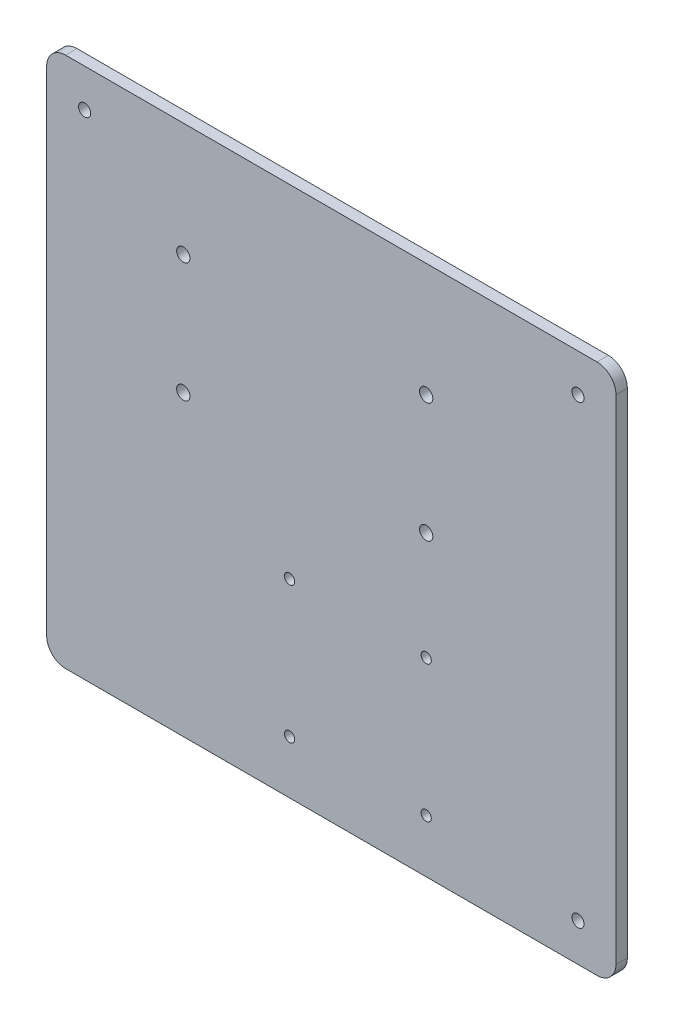
ISO-10303-21;
HEADER;
FILE_DESCRIPTION(('STEP AP214'),'2;1');
FILE_NAME('part.step','',(''),(''),'','','');
FILE_SCHEMA(('AUTOMOTIVE_DESIGN { 1 0 10303 214 1 1 1 1 }'));
ENDSEC;
DATA;
#1=APPLICATION_CONTEXT('core data for automotive mechanical design processes');
#2=APPLICATION_PROTOCOL_DEFINITION('international standard','automotive_design',2000,#1);
#3=PRODUCT_CONTEXT('',#1,'mechanical');
#4=PRODUCT('Part','Part','',(#3));
#5=PRODUCT_RELATED_PRODUCT_CATEGORY('part','',(#4));
#6=PRODUCT_DEFINITION_FORMATION('','',#4);
#7=PRODUCT_DEFINITION_CONTEXT('part definition',#1,'design');
#8=PRODUCT_DEFINITION('design','',#6,#7);
#9=PRODUCT_DEFINITION_SHAPE('','',#8);
#10=(LENGTH_UNIT() NAMED_UNIT(*) SI_UNIT(.MILLI.,.METRE.));
#11=(NAMED_UNIT(*) PLANE_ANGLE_UNIT() SI_UNIT($,.RADIAN.));
#12=(NAMED_UNIT(*) SI_UNIT($,.STERADIAN.) SOLID_ANGLE_UNIT());
#13=UNCERTAINTY_MEASURE_WITH_UNIT(LENGTH_MEASURE(1.E-05),#10,'distance_accuracy_value','');
#14=(GEOMETRIC_REPRESENTATION_CONTEXT(3) GLOBAL_UNCERTAINTY_ASSIGNED_CONTEXT((#13)) GLOBAL_UNIT_ASSIGNED_CONTEXT((#10,
#11,#12)) REPRESENTATION_CONTEXT('',''));
#15=CARTESIAN_POINT('',(0.,0.,0.));
#16=DIRECTION('',(0.,0.,1.));
#17=DIRECTION('',(1.,0.,0.));
#18=AXIS2_PLACEMENT_3D('',#15,#16,#17);
#19=CARTESIAN_POINT('',(75.,70.,3.));
#20=DIRECTION('',(-1.,0.,0.));
#21=DIRECTION('',(0.,-1.,0.));
#22=AXIS2_PLACEMENT_3D('',#19,#20,#21);
#23=PLANE('',#22);
#24=DIRECTION('',(0.,1.,0.));
#25=VECTOR('',#24,1.);
#26=CARTESIAN_POINT('',(75.,70.,3.));
#27=LINE('',#26,#25);
#28=CARTESIAN_POINT('',(75.,-65.,3.));
#29=VERTEX_POINT('',#28);
#30=CARTESIAN_POINT('',(75.,65.,3.));
#31=VERTEX_POINT('',#30);
#32=EDGE_CURVE('E133',#29,#31,#27,.T.);
#33=ORIENTED_EDGE('',*,*,#32,.F.);
#34=DIRECTION('',(0.,0.,-1.));
#35=VECTOR('',#34,1.);
#36=CARTESIAN_POINT('',(75.,-65.,3.));
#37=LINE('',#36,#35);
#38=CARTESIAN_POINT('',(75.,-65.,0.));
#39=VERTEX_POINT('',#38);
#40=EDGE_CURVE('E198',#29,#39,#37,.T.);
#41=ORIENTED_EDGE('',*,*,#40,.T.);
#42=DIRECTION('',(0.,1.,0.));
#43=VECTOR('',#42,1.);
#44=CARTESIAN_POINT('',(75.,70.,0.));
#45=LINE('',#44,#43);
#46=CARTESIAN_POINT('',(75.,65.,0.));
#47=VERTEX_POINT('',#46);
#48=EDGE_CURVE('E155',#39,#47,#45,.T.);
#49=ORIENTED_EDGE('',*,*,#48,.T.);
#50=DIRECTION('',(0.,0.,-1.));
#51=VECTOR('',#50,1.);
#52=CARTESIAN_POINT('',(75.,65.,3.));
#53=LINE('',#52,#51);
#54=EDGE_CURVE('E196',#47,#31,#53,.F.);
#55=ORIENTED_EDGE('',*,*,#54,.T.);
#56=EDGE_LOOP('',(#33,#41,#49,#55));
#57=FACE_BOUND('',#56,.T.);
#58=ADVANCED_FACE('F41',(#57),#23,.F.);
#59=CARTESIAN_POINT('',(-75.,70.,3.));
#60=DIRECTION('',(0.,-1.,0.));
#61=DIRECTION('',(0.,0.,-1.));
#62=AXIS2_PLACEMENT_3D('',#59,#60,#61);
#63=PLANE('',#62);
#64=DIRECTION('',(-1.,0.,0.));
#65=VECTOR('',#64,1.);
#66=CARTESIAN_POINT('',(-75.,70.,3.));
#67=LINE('',#66,#65);
#68=CARTESIAN_POINT('',(70.,70.,3.));
#69=VERTEX_POINT('',#68);
#70=CARTESIAN_POINT('',(-70.,70.,3.));
#71=VERTEX_POINT('',#70);
#72=EDGE_CURVE('E136',#69,#71,#67,.T.);
#73=ORIENTED_EDGE('',*,*,#72,.F.);
#74=DIRECTION('',(0.,0.,-1.));
#75=VECTOR('',#74,1.);
#76=CARTESIAN_POINT('',(70.,70.,3.));
#77=LINE('',#76,#75);
#78=CARTESIAN_POINT('',(70.,70.,0.));
#79=VERTEX_POINT('',#78);
#80=EDGE_CURVE('E11',#69,#79,#77,.T.);
#81=ORIENTED_EDGE('',*,*,#80,.T.);
#82=DIRECTION('',(-1.,0.,0.));
#83=VECTOR('',#82,1.);
#84=CARTESIAN_POINT('',(-75.,70.,0.));
#85=LINE('',#84,#83);
#86=CARTESIAN_POINT('',(-70.,70.,0.));
#87=VERTEX_POINT('',#86);
#88=EDGE_CURVE('E138',#79,#87,#85,.T.);
#89=ORIENTED_EDGE('',*,*,#88,.T.);
#90=DIRECTION('',(0.,0.,-1.));
#91=VECTOR('',#90,1.);
#92=CARTESIAN_POINT('',(-70.,70.,3.));
#93=LINE('',#92,#91);
#94=EDGE_CURVE('E49',#87,#71,#93,.F.);
#95=ORIENTED_EDGE('',*,*,#94,.T.);
#96=EDGE_LOOP('',(#73,#81,#89,#95));
#97=FACE_BOUND('',#96,.T.);
#98=ADVANCED_FACE('F275',(#97),#63,.F.);
#99=CARTESIAN_POINT('',(-75.,70.,3.));
#100=DIRECTION('',(1.,0.,0.));
#101=DIRECTION('',(0.,1.,0.));
#102=AXIS2_PLACEMENT_3D('',#99,#100,#101);
#103=PLANE('',#102);
#104=DIRECTION('',(0.,-1.,0.));
#105=VECTOR('',#104,1.);
#106=CARTESIAN_POINT('',(-75.,70.,0.));
#107=LINE('',#106,#105);
#108=CARTESIAN_POINT('',(-75.,65.,0.));
#109=VERTEX_POINT('',#108);
#110=CARTESIAN_POINT('',(-75.,-65.,0.));
#111=VERTEX_POINT('',#110);
#112=EDGE_CURVE('E134',#109,#111,#107,.T.);
#113=ORIENTED_EDGE('',*,*,#112,.T.);
#114=DIRECTION('',(0.,0.,-1.));
#115=VECTOR('',#114,1.);
#116=CARTESIAN_POINT('',(-75.,-65.,3.));
#117=LINE('',#116,#115);
#118=CARTESIAN_POINT('',(-75.,-65.,3.));
#119=VERTEX_POINT('',#118);
#120=EDGE_CURVE('E112',#111,#119,#117,.F.);
#121=ORIENTED_EDGE('',*,*,#120,.T.);
#122=DIRECTION('',(0.,-1.,0.));
#123=VECTOR('',#122,1.);
#124=CARTESIAN_POINT('',(-75.,70.,3.));
#125=LINE('',#124,#123);
#126=CARTESIAN_POINT('',(-75.,65.,3.));
#127=VERTEX_POINT('',#126);
#128=EDGE_CURVE('E211',#127,#119,#125,.T.);
#129=ORIENTED_EDGE('',*,*,#128,.F.);
#130=DIRECTION('',(0.,0.,-1.));
#131=VECTOR('',#130,1.);
#132=CARTESIAN_POINT('',(-75.,65.,3.));
#133=LINE('',#132,#131);
#134=EDGE_CURVE('E117',#127,#109,#133,.T.);
#135=ORIENTED_EDGE('',*,*,#134,.T.);
#136=EDGE_LOOP('',(#113,#121,#129,#135));
#137=FACE_BOUND('',#136,.T.);
#138=ADVANCED_FACE('F273',(#137),#103,.F.);
#139=CARTESIAN_POINT('',(-75.,-70.,3.));
#140=DIRECTION('',(0.,1.,0.));
#141=DIRECTION('',(0.,0.,1.));
#142=AXIS2_PLACEMENT_3D('',#139,#140,#141);
#143=PLANE('',#142);
#144=DIRECTION('',(1.,0.,0.));
#145=VECTOR('',#144,1.);
#146=CARTESIAN_POINT('',(-75.,-70.,3.));
#147=LINE('',#146,#145);
#148=CARTESIAN_POINT('',(-70.,-70.,3.));
#149=VERTEX_POINT('',#148);
#150=CARTESIAN_POINT('',(70.,-70.,3.));
#151=VERTEX_POINT('',#150);
#152=EDGE_CURVE('E127',#149,#151,#147,.T.);
#153=ORIENTED_EDGE('',*,*,#152,.F.);
#154=DIRECTION('',(0.,0.,-1.));
#155=VECTOR('',#154,1.);
#156=CARTESIAN_POINT('',(-70.,-70.,3.));
#157=LINE('',#156,#155);
#158=CARTESIAN_POINT('',(-70.,-70.,0.));
#159=VERTEX_POINT('',#158);
#160=EDGE_CURVE('E111',#149,#159,#157,.T.);
#161=ORIENTED_EDGE('',*,*,#160,.T.);
#162=DIRECTION('',(1.,0.,0.));
#163=VECTOR('',#162,1.);
#164=CARTESIAN_POINT('',(-75.,-70.,0.));
#165=LINE('',#164,#163);
#166=CARTESIAN_POINT('',(70.,-70.,0.));
#167=VERTEX_POINT('',#166);
#168=EDGE_CURVE('E124',#159,#167,#165,.T.);
#169=ORIENTED_EDGE('',*,*,#168,.T.);
#170=DIRECTION('',(0.,0.,-1.));
#171=VECTOR('',#170,1.);
#172=CARTESIAN_POINT('',(70.,-70.,3.));
#173=LINE('',#172,#171);
#174=EDGE_CURVE('E129',#167,#151,#173,.F.);
#175=ORIENTED_EDGE('',*,*,#174,.T.);
#176=EDGE_LOOP('',(#153,#161,#169,#175));
#177=FACE_BOUND('',#176,.T.);
#178=ADVANCED_FACE('F123',(#177),#143,.F.);
#179=CARTESIAN_POINT('',(0.,0.,3.));
#180=DIRECTION('',(0.,0.,1.));
#181=DIRECTION('',(1.,0.,0.));
#182=AXIS2_PLACEMENT_3D('',#179,#180,#181);
#183=PLANE('',#182);
#184=CARTESIAN_POINT('',(65.0000000000013,-60.,3.));
#185=DIRECTION('',(0.,0.,1.));
#186=DIRECTION('',(1.,0.,0.));
#187=AXIS2_PLACEMENT_3D('',#184,#185,#186);
#188=CIRCLE('',#187,1.60000000000001);
#189=CARTESIAN_POINT('',(66.6000000000013,-60.,3.));
#190=VERTEX_POINT('',#189);
#191=EDGE_CURVE('E238',#190,#190,#188,.T.);
#192=ORIENTED_EDGE('',*,*,#191,.F.);
#193=EDGE_LOOP('',(#192));
#194=FACE_BOUND('',#193,.T.);
#195=CARTESIAN_POINT('',(-65.,59.9999999999991,3.));
#196=DIRECTION('',(0.,0.,1.));
#197=DIRECTION('',(1.,0.,0.));
#198=AXIS2_PLACEMENT_3D('',#195,#196,#197);
#199=CIRCLE('',#198,1.60000000000001);
#200=CARTESIAN_POINT('',(-63.4,59.9999999999991,3.));
#201=VERTEX_POINT('',#200);
#202=EDGE_CURVE('E237',#201,#201,#199,.T.);
#203=ORIENTED_EDGE('',*,*,#202,.F.);
#204=EDGE_LOOP('',(#203));
#205=FACE_BOUND('',#204,.T.);
#206=CARTESIAN_POINT('',(65.,60.,3.));
#207=DIRECTION('',(0.,0.,1.));
#208=DIRECTION('',(1.,0.,0.));
#209=AXIS2_PLACEMENT_3D('',#206,#207,#208);
#210=CIRCLE('',#209,1.60000000000001);
#211=CARTESIAN_POINT('',(66.6,60.,3.));
#212=VERTEX_POINT('',#211);
#213=EDGE_CURVE('E174',#212,#212,#210,.T.);
#214=ORIENTED_EDGE('',*,*,#213,.F.);
#215=EDGE_LOOP('',(#214));
#216=FACE_BOUND('',#215,.T.);
#217=CARTESIAN_POINT('',(25.0000000000004,-56.,3.));
#218=DIRECTION('',(0.,0.,1.));
#219=DIRECTION('',(1.,0.,0.));
#220=AXIS2_PLACEMENT_3D('',#217,#218,#219);
#221=CIRCLE('',#220,1.35);
#222=CARTESIAN_POINT('',(26.3500000000004,-56.,3.));
#223=VERTEX_POINT('',#222);
#224=EDGE_CURVE('E180',#223,#223,#221,.T.);
#225=ORIENTED_EDGE('',*,*,#224,.F.);
#226=EDGE_LOOP('',(#225));
#227=FACE_BOUND('',#226,.T.);
#228=CARTESIAN_POINT('',(-10.9999999999996,-56.0000000000002,3.));
#229=DIRECTION('',(0.,0.,1.));
#230=DIRECTION('',(1.,0.,0.));
#231=AXIS2_PLACEMENT_3D('',#228,#229,#230);
#232=CIRCLE('',#231,1.35);
#233=CARTESIAN_POINT('',(-9.64999999999963,-56.0000000000002,3.));
#234=VERTEX_POINT('',#233);
#235=EDGE_CURVE('E230',#234,#234,#232,.T.);
#236=ORIENTED_EDGE('',*,*,#235,.F.);
#237=EDGE_LOOP('',(#236));
#238=FACE_BOUND('',#237,.T.);
#239=CARTESIAN_POINT('',(-11.,-20.0000000000003,3.));
#240=DIRECTION('',(0.,0.,1.));
#241=DIRECTION('',(1.,0.,0.));
#242=AXIS2_PLACEMENT_3D('',#239,#240,#241);
#243=CIRCLE('',#242,1.35);
#244=CARTESIAN_POINT('',(-9.65,-20.0000000000003,3.));
#245=VERTEX_POINT('',#244);
#246=EDGE_CURVE('E227',#245,#245,#243,.T.);
#247=ORIENTED_EDGE('',*,*,#246,.F.);
#248=EDGE_LOOP('',(#247));
#249=FACE_BOUND('',#248,.T.);
#250=CARTESIAN_POINT('',(25.,-20.,3.));
#251=DIRECTION('',(0.,0.,1.));
#252=DIRECTION('',(1.,0.,0.));
#253=AXIS2_PLACEMENT_3D('',#250,#251,#252);
#254=CIRCLE('',#253,1.35);
#255=CARTESIAN_POINT('',(26.35,-20.,3.));
#256=VERTEX_POINT('',#255);
#257=EDGE_CURVE('E160',#256,#256,#254,.T.);
#258=ORIENTED_EDGE('',*,*,#257,.F.);
#259=EDGE_LOOP('',(#258));
#260=FACE_BOUND('',#259,.T.);
#261=CARTESIAN_POINT('',(-39.,39.9999999999987,3.));
#262=DIRECTION('',(0.,0.,1.));
#263=DIRECTION('',(1.,0.,0.));
#264=AXIS2_PLACEMENT_3D('',#261,#262,#263);
#265=CIRCLE('',#264,1.75);
#266=CARTESIAN_POINT('',(-37.25,39.9999999999987,3.));
#267=VERTEX_POINT('',#266);
#268=EDGE_CURVE('E217',#267,#267,#265,.T.);
#269=ORIENTED_EDGE('',*,*,#268,.F.);
#270=EDGE_LOOP('',(#269));
#271=FACE_BOUND('',#270,.T.);
#272=CARTESIAN_POINT('',(25.0000000000008,8.50000000000001,3.));
#273=DIRECTION('',(0.,0.,1.));
#274=DIRECTION('',(1.,0.,0.));
#275=AXIS2_PLACEMENT_3D('',#272,#273,#274);
#276=CIRCLE('',#275,1.75);
#277=CARTESIAN_POINT('',(26.7500000000008,8.50000000000001,3.));
#278=VERTEX_POINT('',#277);
#279=EDGE_CURVE('E218',#278,#278,#276,.T.);
#280=ORIENTED_EDGE('',*,*,#279,.F.);
#281=EDGE_LOOP('',(#280));
#282=FACE_BOUND('',#281,.T.);
#283=CARTESIAN_POINT('',(-38.9999999999992,8.49999999999868,3.));
#284=DIRECTION('',(0.,0.,1.));
#285=DIRECTION('',(1.,0.,0.));
#286=AXIS2_PLACEMENT_3D('',#283,#284,#285);
#287=CIRCLE('',#286,1.75);
#288=CARTESIAN_POINT('',(-37.2499999999992,8.49999999999868,3.));
#289=VERTEX_POINT('',#288);
#290=EDGE_CURVE('E169',#289,#289,#287,.T.);
#291=ORIENTED_EDGE('',*,*,#290,.F.);
#292=EDGE_LOOP('',(#291));
#293=FACE_BOUND('',#292,.T.);
#294=CARTESIAN_POINT('',(25.,40.,3.));
#295=DIRECTION('',(0.,0.,1.));
#296=DIRECTION('',(1.,0.,0.));
#297=AXIS2_PLACEMENT_3D('',#294,#295,#296);
#298=CIRCLE('',#297,1.75);
#299=CARTESIAN_POINT('',(26.75,40.,3.));
#300=VERTEX_POINT('',#299);
#301=EDGE_CURVE('E146',#300,#300,#298,.T.);
#302=ORIENTED_EDGE('',*,*,#301,.F.);
#303=EDGE_LOOP('',(#302));
#304=FACE_BOUND('',#303,.T.);
#305=ORIENTED_EDGE('',*,*,#128,.T.);
#306=CARTESIAN_POINT('',(-70.,-65.,3.));
#307=DIRECTION('',(0.,0.,1.));
#308=DIRECTION('',(1.,0.,0.));
#309=AXIS2_PLACEMENT_3D('',#306,#307,#308);
#310=CIRCLE('',#309,5.);
#311=EDGE_CURVE('E194',#119,#149,#310,.T.);
#312=ORIENTED_EDGE('',*,*,#311,.T.);
#313=ORIENTED_EDGE('',*,*,#152,.T.);
#314=CARTESIAN_POINT('',(70.,-65.,3.));
#315=DIRECTION('',(0.,0.,1.));
#316=DIRECTION('',(1.,0.,0.));
#317=AXIS2_PLACEMENT_3D('',#314,#315,#316);
#318=CIRCLE('',#317,5.);
#319=EDGE_CURVE('E192',#151,#29,#318,.T.);
#320=ORIENTED_EDGE('',*,*,#319,.T.);
#321=ORIENTED_EDGE('',*,*,#32,.T.);
#322=CARTESIAN_POINT('',(70.,65.,3.));
#323=DIRECTION('',(0.,0.,1.));
#324=DIRECTION('',(1.,0.,0.));
#325=AXIS2_PLACEMENT_3D('',#322,#323,#324);
#326=CIRCLE('',#325,5.);
#327=EDGE_CURVE('E62',#31,#69,#326,.T.);
#328=ORIENTED_EDGE('',*,*,#327,.T.);
#329=ORIENTED_EDGE('',*,*,#72,.T.);
#330=CARTESIAN_POINT('',(-70.,65.,3.));
#331=DIRECTION('',(0.,0.,1.));
#332=DIRECTION('',(1.,0.,0.));
#333=AXIS2_PLACEMENT_3D('',#330,#331,#332);
#334=CIRCLE('',#333,5.);
#335=EDGE_CURVE('E189',#71,#127,#334,.T.);
#336=ORIENTED_EDGE('',*,*,#335,.T.);
#337=EDGE_LOOP('',(#305,#312,#313,#320,#321,#328,#329,#336));
#338=FACE_BOUND('',#337,.T.);
#339=ADVANCED_FACE('F247',(#194,#205,#216,#227,#238,#249,#260,#271,#282,#293,#304,#338),#183,.T.);
#340=CARTESIAN_POINT('',(0.,0.,0.));
#341=DIRECTION('',(0.,0.,1.));
#342=DIRECTION('',(1.,0.,0.));
#343=AXIS2_PLACEMENT_3D('',#340,#341,#342);
#344=PLANE('',#343);
#345=CARTESIAN_POINT('',(65.0000000000013,-60.,0.));
#346=DIRECTION('',(0.,0.,1.));
#347=DIRECTION('',(1.,0.,0.));
#348=AXIS2_PLACEMENT_3D('',#345,#346,#347);
#349=CIRCLE('',#348,1.60000000000001);
#350=CARTESIAN_POINT('',(66.6000000000013,-60.,0.));
#351=VERTEX_POINT('',#350);
#352=EDGE_CURVE('E177',#351,#351,#349,.T.);
#353=ORIENTED_EDGE('',*,*,#352,.T.);
#354=EDGE_LOOP('',(#353));
#355=FACE_BOUND('',#354,.T.);
#356=CARTESIAN_POINT('',(-65.,59.9999999999991,0.));
#357=DIRECTION('',(0.,0.,1.));
#358=DIRECTION('',(1.,0.,0.));
#359=AXIS2_PLACEMENT_3D('',#356,#357,#358);
#360=CIRCLE('',#359,1.60000000000001);
#361=CARTESIAN_POINT('',(-63.4,59.9999999999991,0.));
#362=VERTEX_POINT('',#361);
#363=EDGE_CURVE('E173',#362,#362,#360,.T.);
#364=ORIENTED_EDGE('',*,*,#363,.T.);
#365=EDGE_LOOP('',(#364));
#366=FACE_BOUND('',#365,.T.);
#367=CARTESIAN_POINT('',(65.,60.,0.));
#368=DIRECTION('',(0.,0.,1.));
#369=DIRECTION('',(1.,0.,0.));
#370=AXIS2_PLACEMENT_3D('',#367,#368,#369);
#371=CIRCLE('',#370,1.60000000000001);
#372=CARTESIAN_POINT('',(66.6,60.,0.));
#373=VERTEX_POINT('',#372);
#374=EDGE_CURVE('E170',#373,#373,#371,.T.);
#375=ORIENTED_EDGE('',*,*,#374,.T.);
#376=EDGE_LOOP('',(#375));
#377=FACE_BOUND('',#376,.T.);
#378=CARTESIAN_POINT('',(25.0000000000004,-56.,0.));
#379=DIRECTION('',(0.,0.,1.));
#380=DIRECTION('',(1.,0.,0.));
#381=AXIS2_PLACEMENT_3D('',#378,#379,#380);
#382=CIRCLE('',#381,1.35);
#383=CARTESIAN_POINT('',(26.3500000000004,-56.,0.));
#384=VERTEX_POINT('',#383);
#385=EDGE_CURVE('E166',#384,#384,#382,.T.);
#386=ORIENTED_EDGE('',*,*,#385,.T.);
#387=EDGE_LOOP('',(#386));
#388=FACE_BOUND('',#387,.T.);
#389=CARTESIAN_POINT('',(-10.9999999999996,-56.0000000000002,0.));
#390=DIRECTION('',(0.,0.,1.));
#391=DIRECTION('',(1.,0.,0.));
#392=AXIS2_PLACEMENT_3D('',#389,#390,#391);
#393=CIRCLE('',#392,1.35);
#394=CARTESIAN_POINT('',(-9.64999999999963,-56.0000000000002,0.));
#395=VERTEX_POINT('',#394);
#396=EDGE_CURVE('E163',#395,#395,#393,.T.);
#397=ORIENTED_EDGE('',*,*,#396,.T.);
#398=EDGE_LOOP('',(#397));
#399=FACE_BOUND('',#398,.T.);
#400=CARTESIAN_POINT('',(-11.,-20.0000000000003,0.));
#401=DIRECTION('',(0.,0.,1.));
#402=DIRECTION('',(1.,0.,0.));
#403=AXIS2_PLACEMENT_3D('',#400,#401,#402);
#404=CIRCLE('',#403,1.35);
#405=CARTESIAN_POINT('',(-9.65,-20.0000000000003,0.));
#406=VERTEX_POINT('',#405);
#407=EDGE_CURVE('E159',#406,#406,#404,.T.);
#408=ORIENTED_EDGE('',*,*,#407,.T.);
#409=EDGE_LOOP('',(#408));
#410=FACE_BOUND('',#409,.T.);
#411=CARTESIAN_POINT('',(25.,-20.,0.));
#412=DIRECTION('',(0.,0.,1.));
#413=DIRECTION('',(1.,0.,0.));
#414=AXIS2_PLACEMENT_3D('',#411,#412,#413);
#415=CIRCLE('',#414,1.35);
#416=CARTESIAN_POINT('',(26.35,-20.,0.));
#417=VERTEX_POINT('',#416);
#418=EDGE_CURVE('E156',#417,#417,#415,.T.);
#419=ORIENTED_EDGE('',*,*,#418,.T.);
#420=EDGE_LOOP('',(#419));
#421=FACE_BOUND('',#420,.T.);
#422=CARTESIAN_POINT('',(-39.,39.9999999999987,0.));
#423=DIRECTION('',(0.,0.,1.));
#424=DIRECTION('',(1.,0.,0.));
#425=AXIS2_PLACEMENT_3D('',#422,#423,#424);
#426=CIRCLE('',#425,1.75);
#427=CARTESIAN_POINT('',(-37.25,39.9999999999987,0.));
#428=VERTEX_POINT('',#427);
#429=EDGE_CURVE('E152',#428,#428,#426,.T.);
#430=ORIENTED_EDGE('',*,*,#429,.T.);
#431=EDGE_LOOP('',(#430));
#432=FACE_BOUND('',#431,.T.);
#433=CARTESIAN_POINT('',(25.0000000000008,8.50000000000001,0.));
#434=DIRECTION('',(0.,0.,1.));
#435=DIRECTION('',(1.,0.,0.));
#436=AXIS2_PLACEMENT_3D('',#433,#434,#435);
#437=CIRCLE('',#436,1.75);
#438=CARTESIAN_POINT('',(26.7500000000008,8.50000000000001,0.));
#439=VERTEX_POINT('',#438);
#440=EDGE_CURVE('E149',#439,#439,#437,.T.);
#441=ORIENTED_EDGE('',*,*,#440,.T.);
#442=EDGE_LOOP('',(#441));
#443=FACE_BOUND('',#442,.T.);
#444=CARTESIAN_POINT('',(-38.9999999999992,8.49999999999868,0.));
#445=DIRECTION('',(0.,0.,1.));
#446=DIRECTION('',(1.,0.,0.));
#447=AXIS2_PLACEMENT_3D('',#444,#445,#446);
#448=CIRCLE('',#447,1.75);
#449=CARTESIAN_POINT('',(-37.2499999999992,8.49999999999868,0.));
#450=VERTEX_POINT('',#449);
#451=EDGE_CURVE('E145',#450,#450,#448,.T.);
#452=ORIENTED_EDGE('',*,*,#451,.T.);
#453=EDGE_LOOP('',(#452));
#454=FACE_BOUND('',#453,.T.);
#455=CARTESIAN_POINT('',(25.,40.,0.));
#456=DIRECTION('',(0.,0.,1.));
#457=DIRECTION('',(1.,0.,0.));
#458=AXIS2_PLACEMENT_3D('',#455,#456,#457);
#459=CIRCLE('',#458,1.75);
#460=CARTESIAN_POINT('',(26.75,40.,0.));
#461=VERTEX_POINT('',#460);
#462=EDGE_CURVE('E142',#461,#461,#459,.T.);
#463=ORIENTED_EDGE('',*,*,#462,.T.);
#464=EDGE_LOOP('',(#463));
#465=FACE_BOUND('',#464,.T.);
#466=ORIENTED_EDGE('',*,*,#168,.F.);
#467=CARTESIAN_POINT('',(-70.,-65.,0.));
#468=DIRECTION('',(0.,0.,1.));
#469=DIRECTION('',(1.,0.,0.));
#470=AXIS2_PLACEMENT_3D('',#467,#468,#469);
#471=CIRCLE('',#470,5.);
#472=EDGE_CURVE('E107',#159,#111,#471,.F.);
#473=ORIENTED_EDGE('',*,*,#472,.T.);
#474=ORIENTED_EDGE('',*,*,#112,.F.);
#475=CARTESIAN_POINT('',(-70.,65.,0.));
#476=DIRECTION('',(0.,0.,1.));
#477=DIRECTION('',(1.,0.,0.));
#478=AXIS2_PLACEMENT_3D('',#475,#476,#477);
#479=CIRCLE('',#478,5.);
#480=EDGE_CURVE('E128',#109,#87,#479,.F.);
#481=ORIENTED_EDGE('',*,*,#480,.T.);
#482=ORIENTED_EDGE('',*,*,#88,.F.);
#483=CARTESIAN_POINT('',(70.,65.,0.));
#484=DIRECTION('',(0.,0.,1.));
#485=DIRECTION('',(1.,0.,0.));
#486=AXIS2_PLACEMENT_3D('',#483,#484,#485);
#487=CIRCLE('',#486,5.);
#488=EDGE_CURVE('E183',#79,#47,#487,.F.);
#489=ORIENTED_EDGE('',*,*,#488,.T.);
#490=ORIENTED_EDGE('',*,*,#48,.F.);
#491=CARTESIAN_POINT('',(70.,-65.,0.));
#492=DIRECTION('',(0.,0.,1.));
#493=DIRECTION('',(1.,0.,0.));
#494=AXIS2_PLACEMENT_3D('',#491,#492,#493);
#495=CIRCLE('',#494,5.);
#496=EDGE_CURVE('E118',#39,#167,#495,.F.);
#497=ORIENTED_EDGE('',*,*,#496,.T.);
#498=EDGE_LOOP('',(#466,#473,#474,#481,#482,#489,#490,#497));
#499=FACE_BOUND('',#498,.T.);
#500=ADVANCED_FACE('F131',(#355,#366,#377,#388,#399,#410,#421,#432,#443,#454,#465,#499),#344,.F.);
#501=CARTESIAN_POINT('',(25.,40.,-7.));
#502=DIRECTION('',(0.,0.,1.));
#503=DIRECTION('',(1.,0.,0.));
#504=AXIS2_PLACEMENT_3D('',#501,#502,#503);
#505=CYLINDRICAL_SURFACE('',#504,1.75);
#506=ORIENTED_EDGE('',*,*,#301,.T.);
#507=EDGE_LOOP('',(#506));
#508=FACE_BOUND('',#507,.T.);
#509=ORIENTED_EDGE('',*,*,#462,.F.);
#510=EDGE_LOOP('',(#509));
#511=FACE_BOUND('',#510,.T.);
#512=ADVANCED_FACE('F301',(#508,#511),#505,.F.);
#513=CARTESIAN_POINT('',(-38.9999999999992,8.49999999999868,-7.));
#514=DIRECTION('',(0.,0.,1.));
#515=DIRECTION('',(1.,0.,0.));
#516=AXIS2_PLACEMENT_3D('',#513,#514,#515);
#517=CYLINDRICAL_SURFACE('',#516,1.75);
#518=ORIENTED_EDGE('',*,*,#290,.T.);
#519=EDGE_LOOP('',(#518));
#520=FACE_BOUND('',#519,.T.);
#521=ORIENTED_EDGE('',*,*,#451,.F.);
#522=EDGE_LOOP('',(#521));
#523=FACE_BOUND('',#522,.T.);
#524=ADVANCED_FACE('F306',(#520,#523),#517,.F.);
#525=CARTESIAN_POINT('',(25.0000000000008,8.50000000000001,-7.));
#526=DIRECTION('',(0.,0.,1.));
#527=DIRECTION('',(1.,0.,0.));
#528=AXIS2_PLACEMENT_3D('',#525,#526,#527);
#529=CYLINDRICAL_SURFACE('',#528,1.75);
#530=ORIENTED_EDGE('',*,*,#279,.T.);
#531=EDGE_LOOP('',(#530));
#532=FACE_BOUND('',#531,.T.);
#533=ORIENTED_EDGE('',*,*,#440,.F.);
#534=EDGE_LOOP('',(#533));
#535=FACE_BOUND('',#534,.T.);
#536=ADVANCED_FACE('F308',(#532,#535),#529,.F.);
#537=CARTESIAN_POINT('',(-39.,39.9999999999987,-7.));
#538=DIRECTION('',(0.,0.,1.));
#539=DIRECTION('',(1.,0.,0.));
#540=AXIS2_PLACEMENT_3D('',#537,#538,#539);
#541=CYLINDRICAL_SURFACE('',#540,1.75);
#542=ORIENTED_EDGE('',*,*,#268,.T.);
#543=EDGE_LOOP('',(#542));
#544=FACE_BOUND('',#543,.T.);
#545=ORIENTED_EDGE('',*,*,#429,.F.);
#546=EDGE_LOOP('',(#545));
#547=FACE_BOUND('',#546,.T.);
#548=ADVANCED_FACE('F311',(#544,#547),#541,.F.);
#549=CARTESIAN_POINT('',(25.,-20.,-7.));
#550=DIRECTION('',(0.,0.,1.));
#551=DIRECTION('',(1.,0.,0.));
#552=AXIS2_PLACEMENT_3D('',#549,#550,#551);
#553=CYLINDRICAL_SURFACE('',#552,1.35);
#554=ORIENTED_EDGE('',*,*,#257,.T.);
#555=EDGE_LOOP('',(#554));
#556=FACE_BOUND('',#555,.T.);
#557=ORIENTED_EDGE('',*,*,#418,.F.);
#558=EDGE_LOOP('',(#557));
#559=FACE_BOUND('',#558,.T.);
#560=ADVANCED_FACE('F315',(#556,#559),#553,.F.);
#561=CARTESIAN_POINT('',(-11.,-20.0000000000003,-7.));
#562=DIRECTION('',(0.,0.,1.));
#563=DIRECTION('',(1.,0.,0.));
#564=AXIS2_PLACEMENT_3D('',#561,#562,#563);
#565=CYLINDRICAL_SURFACE('',#564,1.35);
#566=ORIENTED_EDGE('',*,*,#246,.T.);
#567=EDGE_LOOP('',(#566));
#568=FACE_BOUND('',#567,.T.);
#569=ORIENTED_EDGE('',*,*,#407,.F.);
#570=EDGE_LOOP('',(#569));
#571=FACE_BOUND('',#570,.T.);
#572=ADVANCED_FACE('F322',(#568,#571),#565,.F.);
#573=CARTESIAN_POINT('',(-10.9999999999996,-56.0000000000002,-7.));
#574=DIRECTION('',(0.,0.,1.));
#575=DIRECTION('',(1.,0.,0.));
#576=AXIS2_PLACEMENT_3D('',#573,#574,#575);
#577=CYLINDRICAL_SURFACE('',#576,1.35);
#578=ORIENTED_EDGE('',*,*,#235,.T.);
#579=EDGE_LOOP('',(#578));
#580=FACE_BOUND('',#579,.T.);
#581=ORIENTED_EDGE('',*,*,#396,.F.);
#582=EDGE_LOOP('',(#581));
#583=FACE_BOUND('',#582,.T.);
#584=ADVANCED_FACE('F328',(#580,#583),#577,.F.);
#585=CARTESIAN_POINT('',(25.0000000000004,-56.,-7.));
#586=DIRECTION('',(0.,0.,1.));
#587=DIRECTION('',(1.,0.,0.));
#588=AXIS2_PLACEMENT_3D('',#585,#586,#587);
#589=CYLINDRICAL_SURFACE('',#588,1.35);
#590=ORIENTED_EDGE('',*,*,#224,.T.);
#591=EDGE_LOOP('',(#590));
#592=FACE_BOUND('',#591,.T.);
#593=ORIENTED_EDGE('',*,*,#385,.F.);
#594=EDGE_LOOP('',(#593));
#595=FACE_BOUND('',#594,.T.);
#596=ADVANCED_FACE('F324',(#592,#595),#589,.F.);
#597=CARTESIAN_POINT('',(65.,60.,-7.));
#598=DIRECTION('',(0.,0.,1.));
#599=DIRECTION('',(1.,0.,0.));
#600=AXIS2_PLACEMENT_3D('',#597,#598,#599);
#601=CYLINDRICAL_SURFACE('',#600,1.60000000000001);
#602=ORIENTED_EDGE('',*,*,#213,.T.);
#603=EDGE_LOOP('',(#602));
#604=FACE_BOUND('',#603,.T.);
#605=ORIENTED_EDGE('',*,*,#374,.F.);
#606=EDGE_LOOP('',(#605));
#607=FACE_BOUND('',#606,.T.);
#608=ADVANCED_FACE('F327',(#604,#607),#601,.F.);
#609=CARTESIAN_POINT('',(-65.,59.9999999999991,-7.));
#610=DIRECTION('',(0.,0.,1.));
#611=DIRECTION('',(1.,0.,0.));
#612=AXIS2_PLACEMENT_3D('',#609,#610,#611);
#613=CYLINDRICAL_SURFACE('',#612,1.60000000000001);
#614=ORIENTED_EDGE('',*,*,#202,.T.);
#615=EDGE_LOOP('',(#614));
#616=FACE_BOUND('',#615,.T.);
#617=ORIENTED_EDGE('',*,*,#363,.F.);
#618=EDGE_LOOP('',(#617));
#619=FACE_BOUND('',#618,.T.);
#620=ADVANCED_FACE('F244',(#616,#619),#613,.F.);
#621=CARTESIAN_POINT('',(65.0000000000013,-60.,-7.));
#622=DIRECTION('',(0.,0.,1.));
#623=DIRECTION('',(1.,0.,0.));
#624=AXIS2_PLACEMENT_3D('',#621,#622,#623);
#625=CYLINDRICAL_SURFACE('',#624,1.60000000000001);
#626=ORIENTED_EDGE('',*,*,#191,.T.);
#627=EDGE_LOOP('',(#626));
#628=FACE_BOUND('',#627,.T.);
#629=ORIENTED_EDGE('',*,*,#352,.F.);
#630=EDGE_LOOP('',(#629));
#631=FACE_BOUND('',#630,.T.);
#632=ADVANCED_FACE('F286',(#628,#631),#625,.F.);
#633=CARTESIAN_POINT('',(-70.,-65.,3.));
#634=DIRECTION('',(0.,0.,-1.));
#635=DIRECTION('',(-1.,0.,0.));
#636=AXIS2_PLACEMENT_3D('',#633,#634,#635);
#637=CYLINDRICAL_SURFACE('',#636,5.);
#638=ORIENTED_EDGE('',*,*,#311,.F.);
#639=ORIENTED_EDGE('',*,*,#120,.F.);
#640=ORIENTED_EDGE('',*,*,#472,.F.);
#641=ORIENTED_EDGE('',*,*,#160,.F.);
#642=EDGE_LOOP('',(#638,#639,#640,#641));
#643=FACE_BOUND('',#642,.T.);
#644=ADVANCED_FACE('F110',(#643),#637,.T.);
#645=CARTESIAN_POINT('',(70.,-65.,3.));
#646=DIRECTION('',(0.,0.,-1.));
#647=DIRECTION('',(-1.,0.,0.));
#648=AXIS2_PLACEMENT_3D('',#645,#646,#647);
#649=CYLINDRICAL_SURFACE('',#648,5.);
#650=ORIENTED_EDGE('',*,*,#319,.F.);
#651=ORIENTED_EDGE('',*,*,#174,.F.);
#652=ORIENTED_EDGE('',*,*,#496,.F.);
#653=ORIENTED_EDGE('',*,*,#40,.F.);
#654=EDGE_LOOP('',(#650,#651,#652,#653));
#655=FACE_BOUND('',#654,.T.);
#656=ADVANCED_FACE('F279',(#655),#649,.T.);
#657=CARTESIAN_POINT('',(70.,65.,3.));
#658=DIRECTION('',(0.,0.,-1.));
#659=DIRECTION('',(-1.,0.,0.));
#660=AXIS2_PLACEMENT_3D('',#657,#658,#659);
#661=CYLINDRICAL_SURFACE('',#660,5.);
#662=ORIENTED_EDGE('',*,*,#327,.F.);
#663=ORIENTED_EDGE('',*,*,#54,.F.);
#664=ORIENTED_EDGE('',*,*,#488,.F.);
#665=ORIENTED_EDGE('',*,*,#80,.F.);
#666=EDGE_LOOP('',(#662,#663,#664,#665));
#667=FACE_BOUND('',#666,.T.);
#668=ADVANCED_FACE('F278',(#667),#661,.T.);
#669=CARTESIAN_POINT('',(-70.,65.,3.));
#670=DIRECTION('',(0.,0.,-1.));
#671=DIRECTION('',(-1.,0.,0.));
#672=AXIS2_PLACEMENT_3D('',#669,#670,#671);
#673=CYLINDRICAL_SURFACE('',#672,5.);
#674=ORIENTED_EDGE('',*,*,#335,.F.);
#675=ORIENTED_EDGE('',*,*,#94,.F.);
#676=ORIENTED_EDGE('',*,*,#480,.F.);
#677=ORIENTED_EDGE('',*,*,#134,.F.);
#678=EDGE_LOOP('',(#674,#675,#676,#677));
#679=FACE_BOUND('',#678,.T.);
#680=ADVANCED_FACE('F43',(#679),#673,.T.);
#681=CLOSED_SHELL('',(#58,#98,#138,#178,#339,#500,#512,#524,#536,#548,#560,#572,#584,#596,#608,
#620,#632,#644,#656,#668,#680));
#682=MANIFOLD_SOLID_BREP('B2',#681);
#683=ADVANCED_BREP_SHAPE_REPRESENTATION('',(#18,#682),#14);
#684=SHAPE_DEFINITION_REPRESENTATION(#9,#683);
ENDSEC;
END-ISO-10303-21;
